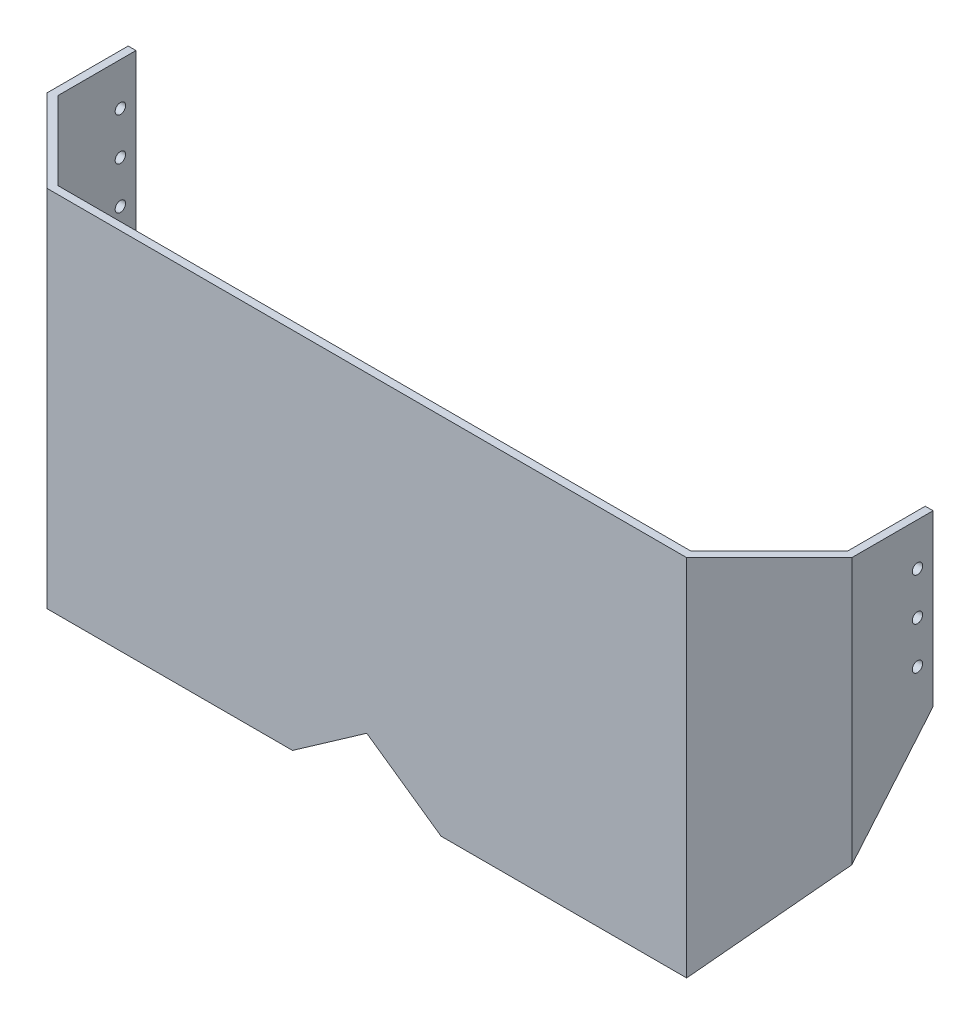
ISO-10303-21;
HEADER;
FILE_DESCRIPTION(('STEP AP214'),'2;1');
FILE_NAME('part.step','',(''),(''),'','','');
FILE_SCHEMA(('AUTOMOTIVE_DESIGN { 1 0 10303 214 1 1 1 1 }'));
ENDSEC;
DATA;
#1=APPLICATION_CONTEXT('core data for automotive mechanical design processes');
#2=APPLICATION_PROTOCOL_DEFINITION('international standard','automotive_design',2000,#1);
#3=PRODUCT_CONTEXT('',#1,'mechanical');
#4=PRODUCT('Part','Part','',(#3));
#5=PRODUCT_RELATED_PRODUCT_CATEGORY('part','',(#4));
#6=PRODUCT_DEFINITION_FORMATION('','',#4);
#7=PRODUCT_DEFINITION_CONTEXT('part definition',#1,'design');
#8=PRODUCT_DEFINITION('design','',#6,#7);
#9=PRODUCT_DEFINITION_SHAPE('','',#8);
#10=(LENGTH_UNIT() NAMED_UNIT(*) SI_UNIT(.MILLI.,.METRE.));
#11=(NAMED_UNIT(*) PLANE_ANGLE_UNIT() SI_UNIT($,.RADIAN.));
#12=(NAMED_UNIT(*) SI_UNIT($,.STERADIAN.) SOLID_ANGLE_UNIT());
#13=UNCERTAINTY_MEASURE_WITH_UNIT(LENGTH_MEASURE(1.E-05),#10,'distance_accuracy_value','');
#14=(GEOMETRIC_REPRESENTATION_CONTEXT(3) GLOBAL_UNCERTAINTY_ASSIGNED_CONTEXT((#13)) GLOBAL_UNIT_ASSIGNED_CONTEXT((#10,
#11,#12)) REPRESENTATION_CONTEXT('',''));
#15=CARTESIAN_POINT('',(0.,0.,0.));
#16=DIRECTION('',(0.,0.,1.));
#17=DIRECTION('',(1.,0.,0.));
#18=AXIS2_PLACEMENT_3D('',#15,#16,#17);
#19=CARTESIAN_POINT('',(-75.8786796564406,35.,-16.5));
#20=DIRECTION('',(-1.,0.,0.));
#21=DIRECTION('',(0.,0.,1.));
#22=AXIS2_PLACEMENT_3D('',#19,#20,#21);
#23=PLANE('',#22);
#24=CARTESIAN_POINT('',(-75.8786796564406,26.8449953689212,-28.5));
#25=DIRECTION('',(-1.,0.,0.));
#26=DIRECTION('',(0.,0.,1.));
#27=AXIS2_PLACEMENT_3D('',#24,#25,#26);
#28=CIRCLE('',#27,1.);
#29=CARTESIAN_POINT('',(-75.8786796564406,26.8449953689212,-27.5));
#30=VERTEX_POINT('',#29);
#31=EDGE_CURVE('E202',#30,#30,#28,.T.);
#32=ORIENTED_EDGE('',*,*,#31,.T.);
#33=EDGE_LOOP('',(#32));
#34=FACE_BOUND('',#33,.T.);
#35=CARTESIAN_POINT('',(-75.8786796564406,10.5349861067637,-28.5));
#36=DIRECTION('',(-1.,0.,0.));
#37=DIRECTION('',(0.,0.,1.));
#38=AXIS2_PLACEMENT_3D('',#35,#36,#37);
#39=CIRCLE('',#38,1.);
#40=CARTESIAN_POINT('',(-75.8786796564406,10.5349861067637,-27.5));
#41=VERTEX_POINT('',#40);
#42=EDGE_CURVE('E507',#41,#41,#39,.T.);
#43=ORIENTED_EDGE('',*,*,#42,.T.);
#44=EDGE_LOOP('',(#43));
#45=FACE_BOUND('',#44,.T.);
#46=CARTESIAN_POINT('',(-75.8786796564406,18.6899907378425,-28.5));
#47=DIRECTION('',(-1.,0.,0.));
#48=DIRECTION('',(0.,0.,1.));
#49=AXIS2_PLACEMENT_3D('',#46,#47,#48);
#50=CIRCLE('',#49,1.);
#51=CARTESIAN_POINT('',(-75.8786796564406,18.6899907378425,-27.5));
#52=VERTEX_POINT('',#51);
#53=EDGE_CURVE('E519',#52,#52,#50,.T.);
#54=ORIENTED_EDGE('',*,*,#53,.T.);
#55=EDGE_LOOP('',(#54));
#56=FACE_BOUND('',#55,.T.);
#57=DIRECTION('',(0.,0.764688187763661,-0.644400477571772));
#58=VECTOR('',#57,1.);
#59=CARTESIAN_POINT('',(-75.8786796564404,-17.2000088211027,-16.5));
#60=LINE('',#59,#58);
#61=CARTESIAN_POINT('',(-75.8786796564405,-17.2000088211025,-16.5000000000001));
#62=VERTEX_POINT('',#61);
#63=CARTESIAN_POINT('',(-75.8786796564404,0.599982357794873,-31.5));
#64=VERTEX_POINT('',#63);
#65=EDGE_CURVE('E184',#62,#64,#60,.T.);
#66=ORIENTED_EDGE('',*,*,#65,.T.);
#67=DIRECTION('',(0.,-1.,0.));
#68=VECTOR('',#67,1.);
#69=CARTESIAN_POINT('',(-75.8786796564406,35.,-31.5));
#70=LINE('',#69,#68);
#71=CARTESIAN_POINT('',(-75.8786796564406,35.,-31.5));
#72=VERTEX_POINT('',#71);
#73=EDGE_CURVE('E216',#72,#64,#70,.T.);
#74=ORIENTED_EDGE('',*,*,#73,.F.);
#75=DIRECTION('',(0.,0.,-1.));
#76=VECTOR('',#75,1.);
#77=CARTESIAN_POINT('',(-75.8786796564406,35.,-16.5));
#78=LINE('',#77,#76);
#79=CARTESIAN_POINT('',(-75.8786796564406,35.,-16.5));
#80=VERTEX_POINT('',#79);
#81=EDGE_CURVE('E452',#80,#72,#78,.T.);
#82=ORIENTED_EDGE('',*,*,#81,.F.);
#83=DIRECTION('',(0.,-1.,0.));
#84=VECTOR('',#83,1.);
#85=CARTESIAN_POINT('',(-75.8786796564406,35.,-16.5));
#86=LINE('',#85,#84);
#87=EDGE_CURVE('E224',#80,#62,#86,.T.);
#88=ORIENTED_EDGE('',*,*,#87,.T.);
#89=EDGE_LOOP('',(#66,#74,#82,#88));
#90=FACE_BOUND('',#89,.T.);
#91=ADVANCED_FACE('F68',(#34,#45,#56,#90),#23,.F.);
#92=CARTESIAN_POINT('',(-75.8786796564406,35.,-31.5));
#93=DIRECTION('',(0.,0.,1.));
#94=DIRECTION('',(1.,0.,0.));
#95=AXIS2_PLACEMENT_3D('',#92,#93,#94);
#96=PLANE('',#95);
#97=DIRECTION('',(0.644400477571707,-0.764688187763716,0.));
#98=VECTOR('',#97,1.);
#99=CARTESIAN_POINT('',(-77.3786796564405,2.37998147568497,-31.5));
#100=LINE('',#99,#98);
#101=CARTESIAN_POINT('',(-77.3786796564405,2.37998147568497,-31.5));
#102=VERTEX_POINT('',#101);
#103=EDGE_CURVE('E201',#102,#64,#100,.T.);
#104=ORIENTED_EDGE('',*,*,#103,.F.);
#105=DIRECTION('',(0.,-1.,0.));
#106=VECTOR('',#105,1.);
#107=CARTESIAN_POINT('',(-77.3786796564406,35.,-31.5));
#108=LINE('',#107,#106);
#109=CARTESIAN_POINT('',(-77.3786796564406,35.,-31.5));
#110=VERTEX_POINT('',#109);
#111=EDGE_CURVE('E200',#110,#102,#108,.T.);
#112=ORIENTED_EDGE('',*,*,#111,.F.);
#113=DIRECTION('',(-1.,0.,0.));
#114=VECTOR('',#113,1.);
#115=CARTESIAN_POINT('',(-75.8786796564406,35.,-31.5));
#116=LINE('',#115,#114);
#117=EDGE_CURVE('E217',#72,#110,#116,.T.);
#118=ORIENTED_EDGE('',*,*,#117,.F.);
#119=ORIENTED_EDGE('',*,*,#73,.T.);
#120=EDGE_LOOP('',(#104,#112,#118,#119));
#121=FACE_BOUND('',#120,.T.);
#122=ADVANCED_FACE('F341',(#121),#96,.F.);
#123=CARTESIAN_POINT('',(-77.3786796564406,35.,-31.5));
#124=DIRECTION('',(1.,0.,0.));
#125=DIRECTION('',(0.,0.,-1.));
#126=AXIS2_PLACEMENT_3D('',#123,#124,#125);
#127=PLANE('',#126);
#128=CARTESIAN_POINT('',(-77.3786796564406,26.8449953689212,-28.5));
#129=DIRECTION('',(1.,0.,0.));
#130=DIRECTION('',(0.,0.,-1.));
#131=AXIS2_PLACEMENT_3D('',#128,#129,#130);
#132=CIRCLE('',#131,1.);
#133=CARTESIAN_POINT('',(-77.3786796564406,26.8449953689212,-29.5));
#134=VERTEX_POINT('',#133);
#135=EDGE_CURVE('E503',#134,#134,#132,.T.);
#136=ORIENTED_EDGE('',*,*,#135,.T.);
#137=EDGE_LOOP('',(#136));
#138=FACE_BOUND('',#137,.T.);
#139=CARTESIAN_POINT('',(-77.3786796564406,10.5349861067637,-28.5));
#140=DIRECTION('',(1.,0.,0.));
#141=DIRECTION('',(0.,0.,-1.));
#142=AXIS2_PLACEMENT_3D('',#139,#140,#141);
#143=CIRCLE('',#142,1.);
#144=CARTESIAN_POINT('',(-77.3786796564406,10.5349861067637,-29.5));
#145=VERTEX_POINT('',#144);
#146=EDGE_CURVE('E512',#145,#145,#143,.T.);
#147=ORIENTED_EDGE('',*,*,#146,.T.);
#148=EDGE_LOOP('',(#147));
#149=FACE_BOUND('',#148,.T.);
#150=CARTESIAN_POINT('',(-77.3786796564406,18.6899907378425,-28.5));
#151=DIRECTION('',(1.,0.,0.));
#152=DIRECTION('',(0.,0.,-1.));
#153=AXIS2_PLACEMENT_3D('',#150,#151,#152);
#154=CIRCLE('',#153,1.);
#155=CARTESIAN_POINT('',(-77.3786796564406,18.6899907378425,-29.5));
#156=VERTEX_POINT('',#155);
#157=EDGE_CURVE('E522',#156,#156,#154,.T.);
#158=ORIENTED_EDGE('',*,*,#157,.T.);
#159=EDGE_LOOP('',(#158));
#160=FACE_BOUND('',#159,.T.);
#161=DIRECTION('',(0.,-0.764688187763661,0.644400477571772));
#162=VECTOR('',#161,1.);
#163=CARTESIAN_POINT('',(-77.3786796564405,-16.1573094788546,-15.8786796564405));
#164=LINE('',#163,#162);
#165=CARTESIAN_POINT('',(-77.3786796564405,-16.1573094788546,-15.8786796564405));
#166=VERTEX_POINT('',#165);
#167=EDGE_CURVE('E180',#102,#166,#164,.T.);
#168=ORIENTED_EDGE('',*,*,#167,.T.);
#169=DIRECTION('',(0.,-1.,0.));
#170=VECTOR('',#169,1.);
#171=CARTESIAN_POINT('',(-77.3786796564406,35.,-15.8786796564405));
#172=LINE('',#171,#170);
#173=CARTESIAN_POINT('',(-77.3786796564406,35.,-15.8786796564405));
#174=VERTEX_POINT('',#173);
#175=EDGE_CURVE('E197',#174,#166,#172,.T.);
#176=ORIENTED_EDGE('',*,*,#175,.F.);
#177=DIRECTION('',(0.,0.,1.));
#178=VECTOR('',#177,1.);
#179=CARTESIAN_POINT('',(-77.3786796564406,35.,-31.5));
#180=LINE('',#179,#178);
#181=EDGE_CURVE('E93',#110,#174,#180,.T.);
#182=ORIENTED_EDGE('',*,*,#181,.F.);
#183=ORIENTED_EDGE('',*,*,#111,.T.);
#184=EDGE_LOOP('',(#168,#176,#182,#183));
#185=FACE_BOUND('',#184,.T.);
#186=ADVANCED_FACE('F195',(#138,#149,#160,#185),#127,.F.);
#187=CARTESIAN_POINT('',(-77.3786796564406,35.,-15.8786796564405));
#188=DIRECTION('',(0.707106781186545,0.,-0.707106781186551));
#189=DIRECTION('',(-0.707106781186551,0.,-0.707106781186545));
#190=AXIS2_PLACEMENT_3D('',#187,#188,#189);
#191=PLANE('',#190);
#192=DIRECTION('',(0.5416752204197,-0.642787609686541,0.541675220419702));
#193=VECTOR('',#192,1.);
#194=CARTESIAN_POINT('',(-61.5,-35.,0.));
#195=LINE('',#194,#193);
#196=CARTESIAN_POINT('',(-61.5,-35.,0.));
#197=VERTEX_POINT('',#196);
#198=EDGE_CURVE('E189',#166,#197,#195,.T.);
#199=ORIENTED_EDGE('',*,*,#198,.T.);
#200=DIRECTION('',(0.,-1.,0.));
#201=VECTOR('',#200,1.);
#202=CARTESIAN_POINT('',(-61.5,35.,0.));
#203=LINE('',#202,#201);
#204=CARTESIAN_POINT('',(-61.5,35.,0.));
#205=VERTEX_POINT('',#204);
#206=EDGE_CURVE('E12',#205,#197,#203,.T.);
#207=ORIENTED_EDGE('',*,*,#206,.F.);
#208=DIRECTION('',(0.70710678118655,0.,0.707106781186544));
#209=VECTOR('',#208,1.);
#210=CARTESIAN_POINT('',(-77.3786796564406,35.,-15.8786796564405));
#211=LINE('',#210,#209);
#212=EDGE_CURVE('E214',#174,#205,#211,.T.);
#213=ORIENTED_EDGE('',*,*,#212,.F.);
#214=ORIENTED_EDGE('',*,*,#175,.T.);
#215=EDGE_LOOP('',(#199,#207,#213,#214));
#216=FACE_BOUND('',#215,.T.);
#217=ADVANCED_FACE('F70',(#216),#191,.F.);
#218=CARTESIAN_POINT('',(-60.8786796564405,35.,-1.50000000000001));
#219=DIRECTION('',(-0.707106781186544,0.,0.707106781186551));
#220=DIRECTION('',(0.707106781186551,0.,0.707106781186544));
#221=AXIS2_PLACEMENT_3D('',#218,#219,#220);
#222=PLANE('',#221);
#223=DIRECTION('',(-0.541675220419704,0.642787609686535,-0.541675220419706));
#224=VECTOR('',#223,1.);
#225=CARTESIAN_POINT('',(-60.8786796564404,-35.,-1.50000000000002));
#226=LINE('',#225,#224);
#227=CARTESIAN_POINT('',(-60.8786796564404,-35.,-1.50000000000002));
#228=VERTEX_POINT('',#227);
#229=EDGE_CURVE('E240',#228,#62,#226,.T.);
#230=ORIENTED_EDGE('',*,*,#229,.T.);
#231=ORIENTED_EDGE('',*,*,#87,.F.);
#232=DIRECTION('',(-0.707106781186551,0.,-0.707106781186544));
#233=VECTOR('',#232,1.);
#234=CARTESIAN_POINT('',(-60.8786796564405,35.,-1.50000000000001));
#235=LINE('',#234,#233);
#236=CARTESIAN_POINT('',(-60.8786796564405,35.,-1.50000000000001));
#237=VERTEX_POINT('',#236);
#238=EDGE_CURVE('E450',#237,#80,#235,.T.);
#239=ORIENTED_EDGE('',*,*,#238,.F.);
#240=DIRECTION('',(0.,-1.,0.));
#241=VECTOR('',#240,1.);
#242=CARTESIAN_POINT('',(-60.8786796564405,35.,-1.50000000000001));
#243=LINE('',#242,#241);
#244=EDGE_CURVE('E555',#237,#228,#243,.T.);
#245=ORIENTED_EDGE('',*,*,#244,.T.);
#246=EDGE_LOOP('',(#230,#231,#239,#245));
#247=FACE_BOUND('',#246,.T.);
#248=ADVANCED_FACE('F354',(#247),#222,.F.);
#249=CARTESIAN_POINT('',(0.,-35.,0.));
#250=DIRECTION('',(0.,-1.,0.));
#251=DIRECTION('',(0.,0.,-1.));
#252=AXIS2_PLACEMENT_3D('',#249,#250,#251);
#253=PLANE('',#252);
#254=DIRECTION('',(1.,0.,0.));
#255=VECTOR('',#254,1.);
#256=CARTESIAN_POINT('',(-61.5,-35.,0.));
#257=LINE('',#256,#255);
#258=CARTESIAN_POINT('',(-14.2814800674213,-35.,0.));
#259=VERTEX_POINT('',#258);
#260=EDGE_CURVE('E244',#197,#259,#257,.T.);
#261=ORIENTED_EDGE('',*,*,#260,.F.);
#262=DIRECTION('',(-0.382683432365075,0.,0.923879532511293));
#263=VECTOR('',#262,1.);
#264=CARTESIAN_POINT('',(-60.8786796564404,-35.,-1.50000000000002));
#265=LINE('',#264,#263);
#266=EDGE_CURVE('E190',#228,#197,#265,.T.);
#267=ORIENTED_EDGE('',*,*,#266,.F.);
#268=DIRECTION('',(-1.,0.,0.));
#269=VECTOR('',#268,1.);
#270=CARTESIAN_POINT('',(-60.8786796564405,-35.,-1.50000000000001));
#271=LINE('',#270,#269);
#272=CARTESIAN_POINT('',(-14.2814800674213,-35.,-1.50000000000002));
#273=VERTEX_POINT('',#272);
#274=EDGE_CURVE('E247',#273,#228,#271,.T.);
#275=ORIENTED_EDGE('',*,*,#274,.F.);
#276=DIRECTION('',(0.,0.,1.));
#277=VECTOR('',#276,1.);
#278=CARTESIAN_POINT('',(-14.2814800674213,-35.,-31.7628929824068));
#279=LINE('',#278,#277);
#280=EDGE_CURVE('E430',#273,#259,#279,.T.);
#281=ORIENTED_EDGE('',*,*,#280,.T.);
#282=EDGE_LOOP('',(#261,#267,#275,#281));
#283=FACE_BOUND('',#282,.T.);
#284=ADVANCED_FACE('F320',(#283),#253,.T.);
#285=CARTESIAN_POINT('',(77.3786796564404,35.,-31.5));
#286=DIRECTION('',(-1.,0.,0.));
#287=DIRECTION('',(0.,0.,1.));
#288=AXIS2_PLACEMENT_3D('',#285,#286,#287);
#289=PLANE('',#288);
#290=CARTESIAN_POINT('',(77.3786796564404,26.8449953689212,-28.5));
#291=DIRECTION('',(-1.,0.,0.));
#292=DIRECTION('',(0.,0.,1.));
#293=AXIS2_PLACEMENT_3D('',#290,#291,#292);
#294=CIRCLE('',#293,1.);
#295=CARTESIAN_POINT('',(77.3786796564404,26.8449953689212,-27.5));
#296=VERTEX_POINT('',#295);
#297=EDGE_CURVE('E502',#296,#296,#294,.T.);
#298=ORIENTED_EDGE('',*,*,#297,.T.);
#299=EDGE_LOOP('',(#298));
#300=FACE_BOUND('',#299,.T.);
#301=CARTESIAN_POINT('',(77.3786796564404,10.5349861067637,-28.5));
#302=DIRECTION('',(-1.,0.,0.));
#303=DIRECTION('',(0.,0.,1.));
#304=AXIS2_PLACEMENT_3D('',#301,#302,#303);
#305=CIRCLE('',#304,1.);
#306=CARTESIAN_POINT('',(77.3786796564404,10.5349861067637,-27.5));
#307=VERTEX_POINT('',#306);
#308=EDGE_CURVE('E515',#307,#307,#305,.T.);
#309=ORIENTED_EDGE('',*,*,#308,.T.);
#310=EDGE_LOOP('',(#309));
#311=FACE_BOUND('',#310,.T.);
#312=CARTESIAN_POINT('',(77.3786796564404,18.6899907378425,-28.5));
#313=DIRECTION('',(-1.,0.,0.));
#314=DIRECTION('',(0.,0.,1.));
#315=AXIS2_PLACEMENT_3D('',#312,#313,#314);
#316=CIRCLE('',#315,1.);
#317=CARTESIAN_POINT('',(77.3786796564404,18.6899907378425,-27.5));
#318=VERTEX_POINT('',#317);
#319=EDGE_CURVE('E525',#318,#318,#316,.T.);
#320=ORIENTED_EDGE('',*,*,#319,.T.);
#321=EDGE_LOOP('',(#320));
#322=FACE_BOUND('',#321,.T.);
#323=DIRECTION('',(0.,-0.764688187763661,0.644400477571772));
#324=VECTOR('',#323,1.);
#325=CARTESIAN_POINT('',(77.3786796564405,-16.1573094788546,-15.8786796564405));
#326=LINE('',#325,#324);
#327=CARTESIAN_POINT('',(77.3786796564405,2.37998147568497,-31.5));
#328=VERTEX_POINT('',#327);
#329=CARTESIAN_POINT('',(77.3786796564404,-16.1573094788546,-15.8786796564405));
#330=VERTEX_POINT('',#329);
#331=EDGE_CURVE('E212',#328,#330,#326,.T.);
#332=ORIENTED_EDGE('',*,*,#331,.F.);
#333=DIRECTION('',(0.,-1.,0.));
#334=VECTOR('',#333,1.);
#335=CARTESIAN_POINT('',(77.3786796564404,35.,-31.5));
#336=LINE('',#335,#334);
#337=CARTESIAN_POINT('',(77.3786796564404,35.,-31.5));
#338=VERTEX_POINT('',#337);
#339=EDGE_CURVE('E283',#338,#328,#336,.T.);
#340=ORIENTED_EDGE('',*,*,#339,.F.);
#341=DIRECTION('',(0.,0.,-1.));
#342=VECTOR('',#341,1.);
#343=CARTESIAN_POINT('',(77.3786796564404,35.,-31.5));
#344=LINE('',#343,#342);
#345=CARTESIAN_POINT('',(77.3786796564404,35.,-15.8786796564405));
#346=VERTEX_POINT('',#345);
#347=EDGE_CURVE('E440',#346,#338,#344,.T.);
#348=ORIENTED_EDGE('',*,*,#347,.F.);
#349=DIRECTION('',(0.,-1.,0.));
#350=VECTOR('',#349,1.);
#351=CARTESIAN_POINT('',(77.3786796564404,35.,-15.8786796564405));
#352=LINE('',#351,#350);
#353=EDGE_CURVE('E259',#346,#330,#352,.T.);
#354=ORIENTED_EDGE('',*,*,#353,.T.);
#355=EDGE_LOOP('',(#332,#340,#348,#354));
#356=FACE_BOUND('',#355,.T.);
#357=ADVANCED_FACE('F309',(#300,#311,#322,#356),#289,.F.);
#358=CARTESIAN_POINT('',(75.8786796564404,35.,-31.5));
#359=DIRECTION('',(0.,0.,1.));
#360=DIRECTION('',(1.,0.,0.));
#361=AXIS2_PLACEMENT_3D('',#358,#359,#360);
#362=PLANE('',#361);
#363=DIRECTION('',(-0.644400477571707,-0.764688187763716,0.));
#364=VECTOR('',#363,1.);
#365=CARTESIAN_POINT('',(77.3786796564405,2.37998147568497,-31.5));
#366=LINE('',#365,#364);
#367=CARTESIAN_POINT('',(75.8786796564404,0.599982357794873,-31.5));
#368=VERTEX_POINT('',#367);
#369=EDGE_CURVE('E388',#328,#368,#366,.T.);
#370=ORIENTED_EDGE('',*,*,#369,.T.);
#371=DIRECTION('',(0.,-1.,0.));
#372=VECTOR('',#371,1.);
#373=CARTESIAN_POINT('',(75.8786796564404,35.,-31.5));
#374=LINE('',#373,#372);
#375=CARTESIAN_POINT('',(75.8786796564404,35.,-31.5));
#376=VERTEX_POINT('',#375);
#377=EDGE_CURVE('E279',#376,#368,#374,.T.);
#378=ORIENTED_EDGE('',*,*,#377,.F.);
#379=DIRECTION('',(-1.,0.,0.));
#380=VECTOR('',#379,1.);
#381=CARTESIAN_POINT('',(75.8786796564404,35.,-31.5));
#382=LINE('',#381,#380);
#383=EDGE_CURVE('E442',#338,#376,#382,.T.);
#384=ORIENTED_EDGE('',*,*,#383,.F.);
#385=ORIENTED_EDGE('',*,*,#339,.T.);
#386=EDGE_LOOP('',(#370,#378,#384,#385));
#387=FACE_BOUND('',#386,.T.);
#388=ADVANCED_FACE('F319',(#387),#362,.F.);
#389=CARTESIAN_POINT('',(75.8786796564404,35.,-16.5000000000001));
#390=DIRECTION('',(1.,0.,0.));
#391=DIRECTION('',(0.,0.,-1.));
#392=AXIS2_PLACEMENT_3D('',#389,#390,#391);
#393=PLANE('',#392);
#394=CARTESIAN_POINT('',(75.8786796564404,26.8449953689212,-28.5));
#395=DIRECTION('',(1.,0.,0.));
#396=DIRECTION('',(0.,0.,-1.));
#397=AXIS2_PLACEMENT_3D('',#394,#395,#396);
#398=CIRCLE('',#397,1.);
#399=CARTESIAN_POINT('',(75.8786796564404,26.8449953689212,-29.5));
#400=VERTEX_POINT('',#399);
#401=EDGE_CURVE('E72',#400,#400,#398,.T.);
#402=ORIENTED_EDGE('',*,*,#401,.T.);
#403=EDGE_LOOP('',(#402));
#404=FACE_BOUND('',#403,.T.);
#405=CARTESIAN_POINT('',(75.8786796564404,10.5349861067637,-28.5));
#406=DIRECTION('',(1.,0.,0.));
#407=DIRECTION('',(0.,0.,-1.));
#408=AXIS2_PLACEMENT_3D('',#405,#406,#407);
#409=CIRCLE('',#408,1.);
#410=CARTESIAN_POINT('',(75.8786796564404,10.5349861067637,-29.5));
#411=VERTEX_POINT('',#410);
#412=EDGE_CURVE('E518',#411,#411,#409,.T.);
#413=ORIENTED_EDGE('',*,*,#412,.T.);
#414=EDGE_LOOP('',(#413));
#415=FACE_BOUND('',#414,.T.);
#416=CARTESIAN_POINT('',(75.8786796564404,18.6899907378425,-28.5));
#417=DIRECTION('',(1.,0.,0.));
#418=DIRECTION('',(0.,0.,-1.));
#419=AXIS2_PLACEMENT_3D('',#416,#417,#418);
#420=CIRCLE('',#419,1.);
#421=CARTESIAN_POINT('',(75.8786796564404,18.6899907378425,-29.5));
#422=VERTEX_POINT('',#421);
#423=EDGE_CURVE('E527',#422,#422,#420,.T.);
#424=ORIENTED_EDGE('',*,*,#423,.T.);
#425=EDGE_LOOP('',(#424));
#426=FACE_BOUND('',#425,.T.);
#427=DIRECTION('',(0.,0.764688187763661,-0.644400477571772));
#428=VECTOR('',#427,1.);
#429=CARTESIAN_POINT('',(75.8786796564404,-17.2000088211027,-16.5));
#430=LINE('',#429,#428);
#431=CARTESIAN_POINT('',(75.8786796564404,-17.2000088211027,-16.5));
#432=VERTEX_POINT('',#431);
#433=EDGE_CURVE('E270',#432,#368,#430,.T.);
#434=ORIENTED_EDGE('',*,*,#433,.F.);
#435=DIRECTION('',(0.,-1.,0.));
#436=VECTOR('',#435,1.);
#437=CARTESIAN_POINT('',(75.8786796564404,35.,-16.5000000000001));
#438=LINE('',#437,#436);
#439=CARTESIAN_POINT('',(75.8786796564404,35.,-16.5000000000001));
#440=VERTEX_POINT('',#439);
#441=EDGE_CURVE('E284',#440,#432,#438,.T.);
#442=ORIENTED_EDGE('',*,*,#441,.F.);
#443=DIRECTION('',(0.,0.,1.));
#444=VECTOR('',#443,1.);
#445=CARTESIAN_POINT('',(75.8786796564404,35.,-16.5000000000001));
#446=LINE('',#445,#444);
#447=EDGE_CURVE('E444',#376,#440,#446,.T.);
#448=ORIENTED_EDGE('',*,*,#447,.F.);
#449=ORIENTED_EDGE('',*,*,#377,.T.);
#450=EDGE_LOOP('',(#434,#442,#448,#449));
#451=FACE_BOUND('',#450,.T.);
#452=ADVANCED_FACE('F536',(#404,#415,#426,#451),#393,.F.);
#453=CARTESIAN_POINT('',(60.8786796564404,-35.,-1.50000000000002));
#454=VERTEX_POINT('',#453);
#455=CARTESIAN_POINT('',(14.2814800674213,-35.,-1.50000000000002));
#456=VERTEX_POINT('',#455);
#457=EDGE_CURVE('E436',#454,#456,#271,.T.);
#458=ORIENTED_EDGE('',*,*,#457,.F.);
#459=DIRECTION('',(0.382683432365075,0.,0.923879532511293));
#460=VECTOR('',#459,1.);
#461=CARTESIAN_POINT('',(60.8786796564404,-35.,-1.50000000000002));
#462=LINE('',#461,#460);
#463=CARTESIAN_POINT('',(61.5,-35.,0.));
#464=VERTEX_POINT('',#463);
#465=EDGE_CURVE('E269',#454,#464,#462,.T.);
#466=ORIENTED_EDGE('',*,*,#465,.T.);
#467=CARTESIAN_POINT('',(14.2814800674213,-35.,0.));
#468=VERTEX_POINT('',#467);
#469=EDGE_CURVE('E248',#468,#464,#257,.T.);
#470=ORIENTED_EDGE('',*,*,#469,.F.);
#471=DIRECTION('',(0.,0.,1.));
#472=VECTOR('',#471,1.);
#473=CARTESIAN_POINT('',(14.2814800674213,-35.,-31.7628929824068));
#474=LINE('',#473,#472);
#475=EDGE_CURVE('E424',#456,#468,#474,.T.);
#476=ORIENTED_EDGE('',*,*,#475,.F.);
#477=EDGE_LOOP('',(#458,#466,#470,#476));
#478=FACE_BOUND('',#477,.T.);
#479=ADVANCED_FACE('F325',(#478),#253,.T.);
#480=CARTESIAN_POINT('',(77.3786796564404,35.,-15.8786796564405));
#481=DIRECTION('',(-0.707106781186549,0.,-0.707106781186546));
#482=DIRECTION('',(-0.707106781186546,0.,0.707106781186549));
#483=AXIS2_PLACEMENT_3D('',#480,#481,#482);
#484=PLANE('',#483);
#485=DIRECTION('',(-0.5416752204197,-0.642787609686541,0.541675220419702));
#486=VECTOR('',#485,1.);
#487=CARTESIAN_POINT('',(61.5,-35.,0.));
#488=LINE('',#487,#486);
#489=EDGE_CURVE('E273',#330,#464,#488,.T.);
#490=ORIENTED_EDGE('',*,*,#489,.F.);
#491=ORIENTED_EDGE('',*,*,#353,.F.);
#492=DIRECTION('',(0.707106781186546,0.,-0.707106781186549));
#493=VECTOR('',#492,1.);
#494=CARTESIAN_POINT('',(77.3786796564404,35.,-15.8786796564405));
#495=LINE('',#494,#493);
#496=CARTESIAN_POINT('',(61.5,35.,0.));
#497=VERTEX_POINT('',#496);
#498=EDGE_CURVE('E438',#497,#346,#495,.T.);
#499=ORIENTED_EDGE('',*,*,#498,.F.);
#500=DIRECTION('',(0.,-1.,0.));
#501=VECTOR('',#500,1.);
#502=CARTESIAN_POINT('',(61.5,35.,0.));
#503=LINE('',#502,#501);
#504=EDGE_CURVE('E77',#497,#464,#503,.T.);
#505=ORIENTED_EDGE('',*,*,#504,.T.);
#506=EDGE_LOOP('',(#490,#491,#499,#505));
#507=FACE_BOUND('',#506,.T.);
#508=ADVANCED_FACE('F322',(#507),#484,.F.);
#509=CARTESIAN_POINT('',(60.8786796564404,35.,-1.50000000000002));
#510=DIRECTION('',(0.707106781186549,0.,0.707106781186546));
#511=DIRECTION('',(0.707106781186546,0.,-0.707106781186549));
#512=AXIS2_PLACEMENT_3D('',#509,#510,#511);
#513=PLANE('',#512);
#514=DIRECTION('',(0.541675220419704,0.642787609686535,-0.541675220419706));
#515=VECTOR('',#514,1.);
#516=CARTESIAN_POINT('',(60.8786796564404,-35.,-1.50000000000002));
#517=LINE('',#516,#515);
#518=EDGE_CURVE('E266',#454,#432,#517,.T.);
#519=ORIENTED_EDGE('',*,*,#518,.F.);
#520=DIRECTION('',(0.,-1.,0.));
#521=VECTOR('',#520,1.);
#522=CARTESIAN_POINT('',(60.8786796564404,35.,-1.50000000000002));
#523=LINE('',#522,#521);
#524=CARTESIAN_POINT('',(60.8786796564404,35.,-1.50000000000002));
#525=VERTEX_POINT('',#524);
#526=EDGE_CURVE('E554',#525,#454,#523,.T.);
#527=ORIENTED_EDGE('',*,*,#526,.F.);
#528=DIRECTION('',(-0.707106781186546,0.,0.707106781186549));
#529=VECTOR('',#528,1.);
#530=CARTESIAN_POINT('',(60.8786796564404,35.,-1.50000000000002));
#531=LINE('',#530,#529);
#532=EDGE_CURVE('E446',#440,#525,#531,.T.);
#533=ORIENTED_EDGE('',*,*,#532,.F.);
#534=ORIENTED_EDGE('',*,*,#441,.T.);
#535=EDGE_LOOP('',(#519,#527,#533,#534));
#536=FACE_BOUND('',#535,.T.);
#537=ADVANCED_FACE('F324',(#536),#513,.F.);
#538=CARTESIAN_POINT('',(-61.5,35.,0.));
#539=DIRECTION('',(0.,0.,-1.));
#540=DIRECTION('',(-1.,0.,0.));
#541=AXIS2_PLACEMENT_3D('',#538,#539,#540);
#542=PLANE('',#541);
#543=DIRECTION('',(-0.819152044288995,-0.573576436351042,0.));
#544=VECTOR('',#543,1.);
#545=CARTESIAN_POINT('',(0.,-25.,0.));
#546=LINE('',#545,#544);
#547=CARTESIAN_POINT('',(0.,-25.,0.));
#548=VERTEX_POINT('',#547);
#549=EDGE_CURVE('E85',#548,#259,#546,.T.);
#550=ORIENTED_EDGE('',*,*,#549,.F.);
#551=DIRECTION('',(-0.819152044288995,0.573576436351042,0.));
#552=VECTOR('',#551,1.);
#553=CARTESIAN_POINT('',(14.2814800674213,-35.,0.));
#554=LINE('',#553,#552);
#555=EDGE_CURVE('E275',#468,#548,#554,.T.);
#556=ORIENTED_EDGE('',*,*,#555,.F.);
#557=ORIENTED_EDGE('',*,*,#469,.T.);
#558=ORIENTED_EDGE('',*,*,#504,.F.);
#559=DIRECTION('',(1.,0.,0.));
#560=VECTOR('',#559,1.);
#561=CARTESIAN_POINT('',(-61.5,35.,0.));
#562=LINE('',#561,#560);
#563=EDGE_CURVE('E435',#205,#497,#562,.T.);
#564=ORIENTED_EDGE('',*,*,#563,.F.);
#565=ORIENTED_EDGE('',*,*,#206,.T.);
#566=ORIENTED_EDGE('',*,*,#260,.T.);
#567=EDGE_LOOP('',(#550,#556,#557,#558,#564,#565,#566));
#568=FACE_BOUND('',#567,.T.);
#569=ADVANCED_FACE('F327',(#568),#542,.F.);
#570=CARTESIAN_POINT('',(-60.8786796564405,35.,-1.50000000000001));
#571=DIRECTION('',(0.,0.,1.));
#572=DIRECTION('',(1.,0.,0.));
#573=AXIS2_PLACEMENT_3D('',#570,#571,#572);
#574=PLANE('',#573);
#575=ORIENTED_EDGE('',*,*,#457,.T.);
#576=DIRECTION('',(0.819152044288995,-0.573576436351042,0.));
#577=VECTOR('',#576,1.);
#578=CARTESIAN_POINT('',(14.2814800674213,-35.,-1.50000000000002));
#579=LINE('',#578,#577);
#580=CARTESIAN_POINT('',(0.,-25.,-1.50000000000002));
#581=VERTEX_POINT('',#580);
#582=EDGE_CURVE('E422',#581,#456,#579,.T.);
#583=ORIENTED_EDGE('',*,*,#582,.F.);
#584=DIRECTION('',(0.819152044288995,0.573576436351042,0.));
#585=VECTOR('',#584,1.);
#586=CARTESIAN_POINT('',(0.,-25.,-1.50000000000002));
#587=LINE('',#586,#585);
#588=EDGE_CURVE('E258',#273,#581,#587,.T.);
#589=ORIENTED_EDGE('',*,*,#588,.F.);
#590=ORIENTED_EDGE('',*,*,#274,.T.);
#591=ORIENTED_EDGE('',*,*,#244,.F.);
#592=DIRECTION('',(-1.,0.,0.));
#593=VECTOR('',#592,1.);
#594=CARTESIAN_POINT('',(-60.8786796564405,35.,-1.50000000000001));
#595=LINE('',#594,#593);
#596=EDGE_CURVE('E448',#525,#237,#595,.T.);
#597=ORIENTED_EDGE('',*,*,#596,.F.);
#598=ORIENTED_EDGE('',*,*,#526,.T.);
#599=EDGE_LOOP('',(#575,#583,#589,#590,#591,#597,#598));
#600=FACE_BOUND('',#599,.T.);
#601=ADVANCED_FACE('F329',(#600),#574,.F.);
#602=CARTESIAN_POINT('',(0.,35.,0.));
#603=DIRECTION('',(0.,-1.,0.));
#604=DIRECTION('',(0.,0.,-1.));
#605=AXIS2_PLACEMENT_3D('',#602,#603,#604);
#606=PLANE('',#605);
#607=ORIENTED_EDGE('',*,*,#212,.T.);
#608=ORIENTED_EDGE('',*,*,#563,.T.);
#609=ORIENTED_EDGE('',*,*,#498,.T.);
#610=ORIENTED_EDGE('',*,*,#347,.T.);
#611=ORIENTED_EDGE('',*,*,#383,.T.);
#612=ORIENTED_EDGE('',*,*,#447,.T.);
#613=ORIENTED_EDGE('',*,*,#532,.T.);
#614=ORIENTED_EDGE('',*,*,#596,.T.);
#615=ORIENTED_EDGE('',*,*,#238,.T.);
#616=ORIENTED_EDGE('',*,*,#81,.T.);
#617=ORIENTED_EDGE('',*,*,#117,.T.);
#618=ORIENTED_EDGE('',*,*,#181,.T.);
#619=EDGE_LOOP('',(#607,#608,#609,#610,#611,#612,#613,#614,#615,#616,#617,#618));
#620=FACE_BOUND('',#619,.T.);
#621=ADVANCED_FACE('F335',(#620),#606,.F.);
#622=CARTESIAN_POINT('',(14.2814800674213,-35.,-31.7628929824068));
#623=DIRECTION('',(0.573576436351042,0.819152044288995,0.));
#624=DIRECTION('',(-0.819152044288995,0.573576436351042,0.));
#625=AXIS2_PLACEMENT_3D('',#622,#623,#624);
#626=PLANE('',#625);
#627=ORIENTED_EDGE('',*,*,#582,.T.);
#628=ORIENTED_EDGE('',*,*,#475,.T.);
#629=ORIENTED_EDGE('',*,*,#555,.T.);
#630=DIRECTION('',(0.,0.,1.));
#631=VECTOR('',#630,1.);
#632=CARTESIAN_POINT('',(0.,-25.,-31.7628929824068));
#633=LINE('',#632,#631);
#634=EDGE_CURVE('E428',#581,#548,#633,.T.);
#635=ORIENTED_EDGE('',*,*,#634,.F.);
#636=EDGE_LOOP('',(#627,#628,#629,#635));
#637=FACE_BOUND('',#636,.T.);
#638=ADVANCED_FACE('F588',(#637),#626,.F.);
#639=CARTESIAN_POINT('',(0.,-25.,-31.7628929824068));
#640=DIRECTION('',(-0.573576436351042,0.819152044288995,0.));
#641=DIRECTION('',(-0.819152044288995,-0.573576436351042,0.));
#642=AXIS2_PLACEMENT_3D('',#639,#640,#641);
#643=PLANE('',#642);
#644=ORIENTED_EDGE('',*,*,#588,.T.);
#645=ORIENTED_EDGE('',*,*,#634,.T.);
#646=ORIENTED_EDGE('',*,*,#549,.T.);
#647=ORIENTED_EDGE('',*,*,#280,.F.);
#648=EDGE_LOOP('',(#644,#645,#646,#647));
#649=FACE_BOUND('',#648,.T.);
#650=ADVANCED_FACE('F590',(#649),#643,.F.);
#651=CARTESIAN_POINT('',(39.8215157602038,-47.4574344697689,-16.4946119021296));
#652=DIRECTION('',(0.62114802686934,-0.740255392554327,-0.257287936970556));
#653=DIRECTION('',(0.766044443118972,0.642787609686546,0.));
#654=AXIS2_PLACEMENT_3D('',#651,#652,#653);
#655=PLANE('',#654);
#656=ORIENTED_EDGE('',*,*,#465,.F.);
#657=ORIENTED_EDGE('',*,*,#518,.T.);
#658=DIRECTION('',(0.777373129762879,0.540377634056682,0.321998493372204));
#659=VECTOR('',#658,1.);
#660=CARTESIAN_POINT('',(75.8786796564405,-17.2000088211025,-16.5000000000001));
#661=LINE('',#660,#659);
#662=EDGE_CURVE('E276',#432,#330,#661,.T.);
#663=ORIENTED_EDGE('',*,*,#662,.T.);
#664=ORIENTED_EDGE('',*,*,#489,.T.);
#665=EDGE_LOOP('',(#656,#657,#663,#664));
#666=FACE_BOUND('',#665,.T.);
#667=ADVANCED_FACE('F400',(#666),#655,.T.);
#668=CARTESIAN_POINT('',(39.4345468618228,-33.2313761834053,-39.434546861816));
#669=DIRECTION('',(0.60744123816363,-0.511888937521216,-0.607441238163525));
#670=DIRECTION('',(-0.707106781186486,0.,-0.707106781186609));
#671=AXIS2_PLACEMENT_3D('',#668,#669,#670);
#672=PLANE('',#671);
#673=ORIENTED_EDGE('',*,*,#369,.F.);
#674=ORIENTED_EDGE('',*,*,#331,.T.);
#675=ORIENTED_EDGE('',*,*,#662,.F.);
#676=ORIENTED_EDGE('',*,*,#433,.T.);
#677=EDGE_LOOP('',(#673,#674,#675,#676));
#678=FACE_BOUND('',#677,.T.);
#679=ADVANCED_FACE('F390',(#678),#672,.T.);
#680=CARTESIAN_POINT('',(-39.8215157602038,-47.4574344697689,-16.4946119021296));
#681=DIRECTION('',(-0.62114802686934,-0.740255392554327,-0.257287936970556));
#682=DIRECTION('',(-0.766044443118972,0.642787609686546,0.));
#683=AXIS2_PLACEMENT_3D('',#680,#681,#682);
#684=PLANE('',#683);
#685=ORIENTED_EDGE('',*,*,#266,.T.);
#686=ORIENTED_EDGE('',*,*,#198,.F.);
#687=DIRECTION('',(-0.777373129762879,0.540377634056682,0.321998493372204));
#688=VECTOR('',#687,1.);
#689=CARTESIAN_POINT('',(-75.8786796564405,-17.2000088211025,-16.5000000000001));
#690=LINE('',#689,#688);
#691=EDGE_CURVE('E177',#62,#166,#690,.T.);
#692=ORIENTED_EDGE('',*,*,#691,.F.);
#693=ORIENTED_EDGE('',*,*,#229,.F.);
#694=EDGE_LOOP('',(#685,#686,#692,#693));
#695=FACE_BOUND('',#694,.T.);
#696=ADVANCED_FACE('F207',(#695),#684,.T.);
#697=CARTESIAN_POINT('',(-39.4345468618228,-33.2313761834053,-39.434546861816));
#698=DIRECTION('',(-0.60744123816363,-0.511888937521216,-0.607441238163525));
#699=DIRECTION('',(0.707106781186486,0.,-0.707106781186609));
#700=AXIS2_PLACEMENT_3D('',#697,#698,#699);
#701=PLANE('',#700);
#702=ORIENTED_EDGE('',*,*,#103,.T.);
#703=ORIENTED_EDGE('',*,*,#65,.F.);
#704=ORIENTED_EDGE('',*,*,#691,.T.);
#705=ORIENTED_EDGE('',*,*,#167,.F.);
#706=EDGE_LOOP('',(#702,#703,#704,#705));
#707=FACE_BOUND('',#706,.T.);
#708=ADVANCED_FACE('F179',(#707),#701,.T.);
#709=CARTESIAN_POINT('',(-77.3787796564406,18.6899907378425,-28.5));
#710=DIRECTION('',(1.,0.,0.));
#711=DIRECTION('',(0.,0.,-1.));
#712=AXIS2_PLACEMENT_3D('',#709,#710,#711);
#713=CYLINDRICAL_SURFACE('',#712,1.);
#714=ORIENTED_EDGE('',*,*,#423,.F.);
#715=EDGE_LOOP('',(#714));
#716=FACE_BOUND('',#715,.T.);
#717=ORIENTED_EDGE('',*,*,#319,.F.);
#718=EDGE_LOOP('',(#717));
#719=FACE_BOUND('',#718,.T.);
#720=ADVANCED_FACE('F472',(#716,#719),#713,.F.);
#721=CARTESIAN_POINT('',(-77.3787796564406,10.5349861067637,-28.5));
#722=DIRECTION('',(1.,0.,0.));
#723=DIRECTION('',(0.,0.,-1.));
#724=AXIS2_PLACEMENT_3D('',#721,#722,#723);
#725=CYLINDRICAL_SURFACE('',#724,1.);
#726=ORIENTED_EDGE('',*,*,#412,.F.);
#727=EDGE_LOOP('',(#726));
#728=FACE_BOUND('',#727,.T.);
#729=ORIENTED_EDGE('',*,*,#308,.F.);
#730=EDGE_LOOP('',(#729));
#731=FACE_BOUND('',#730,.T.);
#732=ADVANCED_FACE('F484',(#728,#731),#725,.F.);
#733=CARTESIAN_POINT('',(-77.3787796564406,26.8449953689212,-28.5));
#734=DIRECTION('',(1.,0.,0.));
#735=DIRECTION('',(0.,0.,-1.));
#736=AXIS2_PLACEMENT_3D('',#733,#734,#735);
#737=CYLINDRICAL_SURFACE('',#736,1.);
#738=ORIENTED_EDGE('',*,*,#401,.F.);
#739=EDGE_LOOP('',(#738));
#740=FACE_BOUND('',#739,.T.);
#741=ORIENTED_EDGE('',*,*,#297,.F.);
#742=EDGE_LOOP('',(#741));
#743=FACE_BOUND('',#742,.T.);
#744=ADVANCED_FACE('F478',(#740,#743),#737,.F.);
#745=ORIENTED_EDGE('',*,*,#157,.F.);
#746=EDGE_LOOP('',(#745));
#747=FACE_BOUND('',#746,.T.);
#748=ORIENTED_EDGE('',*,*,#53,.F.);
#749=EDGE_LOOP('',(#748));
#750=FACE_BOUND('',#749,.T.);
#751=ADVANCED_FACE('F473',(#747,#750),#713,.F.);
#752=ORIENTED_EDGE('',*,*,#146,.F.);
#753=EDGE_LOOP('',(#752));
#754=FACE_BOUND('',#753,.T.);
#755=ORIENTED_EDGE('',*,*,#42,.F.);
#756=EDGE_LOOP('',(#755));
#757=FACE_BOUND('',#756,.T.);
#758=ADVANCED_FACE('F477',(#754,#757),#725,.F.);
#759=ORIENTED_EDGE('',*,*,#135,.F.);
#760=EDGE_LOOP('',(#759));
#761=FACE_BOUND('',#760,.T.);
#762=ORIENTED_EDGE('',*,*,#31,.F.);
#763=EDGE_LOOP('',(#762));
#764=FACE_BOUND('',#763,.T.);
#765=ADVANCED_FACE('F482',(#761,#764),#737,.F.);
#766=CLOSED_SHELL('',(#91,#122,#186,#217,#248,#284,#357,#388,#452,#479,#508,#537,#569,#601,#621,
#638,#650,#667,#679,#696,#708,#720,#732,#744,#751,#758,#765));
#767=MANIFOLD_SOLID_BREP('B2',#766);
#768=ADVANCED_BREP_SHAPE_REPRESENTATION('',(#18,#767),#14);
#769=SHAPE_DEFINITION_REPRESENTATION(#9,#768);
ENDSEC;
END-ISO-10303-21;
